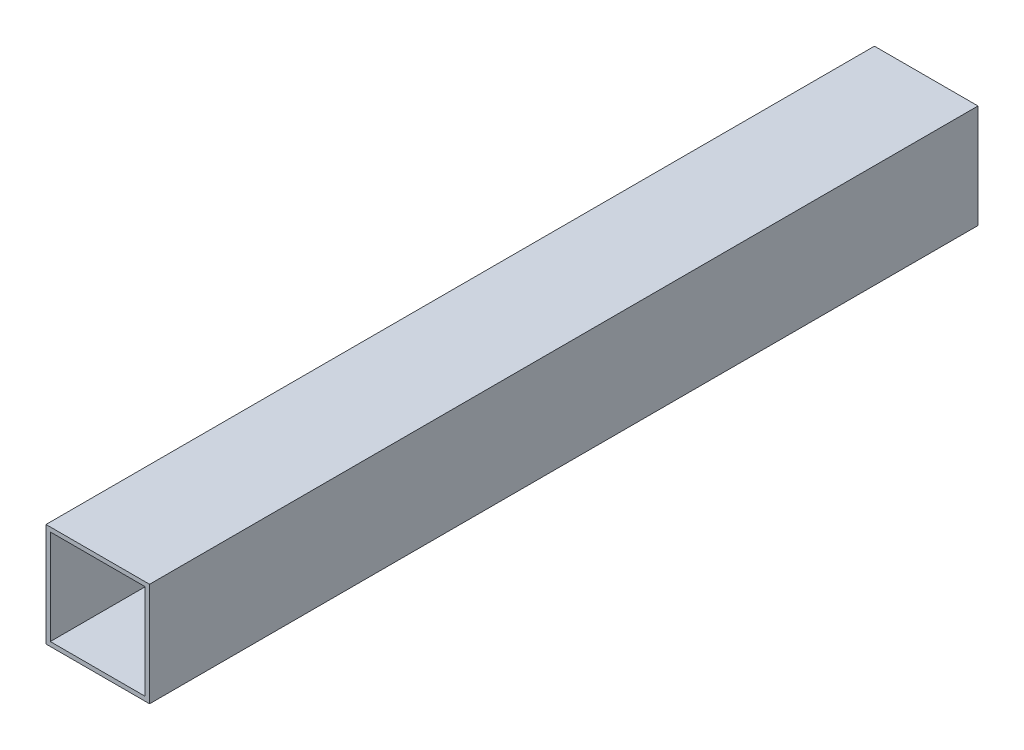
ISO-10303-21;
HEADER;
FILE_DESCRIPTION(('STEP AP214'),'2;1');
FILE_NAME('part.step','',(''),(''),'','','');
FILE_SCHEMA(('AUTOMOTIVE_DESIGN { 1 0 10303 214 1 1 1 1 }'));
ENDSEC;
DATA;
#1=APPLICATION_CONTEXT('core data for automotive mechanical design processes');
#2=APPLICATION_PROTOCOL_DEFINITION('international standard','automotive_design',2000,#1);
#3=PRODUCT_CONTEXT('',#1,'mechanical');
#4=PRODUCT('Part','Part','',(#3));
#5=PRODUCT_RELATED_PRODUCT_CATEGORY('part','',(#4));
#6=PRODUCT_DEFINITION_FORMATION('','',#4);
#7=PRODUCT_DEFINITION_CONTEXT('part definition',#1,'design');
#8=PRODUCT_DEFINITION('design','',#6,#7);
#9=PRODUCT_DEFINITION_SHAPE('','',#8);
#10=(LENGTH_UNIT() NAMED_UNIT(*) SI_UNIT(.MILLI.,.METRE.));
#11=(NAMED_UNIT(*) PLANE_ANGLE_UNIT() SI_UNIT($,.RADIAN.));
#12=(NAMED_UNIT(*) SI_UNIT($,.STERADIAN.) SOLID_ANGLE_UNIT());
#13=UNCERTAINTY_MEASURE_WITH_UNIT(LENGTH_MEASURE(1.E-05),#10,'distance_accuracy_value','');
#14=(GEOMETRIC_REPRESENTATION_CONTEXT(3) GLOBAL_UNCERTAINTY_ASSIGNED_CONTEXT((#13)) GLOBAL_UNIT_ASSIGNED_CONTEXT((#10,
#11,#12)) REPRESENTATION_CONTEXT('',''));
#15=CARTESIAN_POINT('',(0.,0.,0.));
#16=DIRECTION('',(0.,0.,1.));
#17=DIRECTION('',(1.,0.,0.));
#18=AXIS2_PLACEMENT_3D('',#15,#16,#17);
#19=CARTESIAN_POINT('',(0.,0.,304.8));
#20=DIRECTION('',(0.,0.,-1.));
#21=DIRECTION('',(-1.,0.,0.));
#22=AXIS2_PLACEMENT_3D('',#19,#20,#21);
#23=PLANE('',#22);
#24=DIRECTION('',(0.,-1.,0.));
#25=VECTOR('',#24,1.);
#26=CARTESIAN_POINT('',(0.,0.,304.8));
#27=LINE('',#26,#25);
#28=CARTESIAN_POINT('',(0.,38.1,304.8));
#29=VERTEX_POINT('',#28);
#30=CARTESIAN_POINT('',(0.,0.,304.8));
#31=VERTEX_POINT('',#30);
#32=EDGE_CURVE('E134',#29,#31,#27,.T.);
#33=ORIENTED_EDGE('',*,*,#32,.T.);
#34=DIRECTION('',(1.,0.,0.));
#35=VECTOR('',#34,1.);
#36=CARTESIAN_POINT('',(0.,0.,304.8));
#37=LINE('',#36,#35);
#38=CARTESIAN_POINT('',(38.1,0.,304.8));
#39=VERTEX_POINT('',#38);
#40=EDGE_CURVE('E137',#31,#39,#37,.T.);
#41=ORIENTED_EDGE('',*,*,#40,.T.);
#42=DIRECTION('',(0.,1.,0.));
#43=VECTOR('',#42,1.);
#44=CARTESIAN_POINT('',(38.1,0.,304.8));
#45=LINE('',#44,#43);
#46=CARTESIAN_POINT('',(38.1,38.1,304.8));
#47=VERTEX_POINT('',#46);
#48=EDGE_CURVE('E140',#39,#47,#45,.T.);
#49=ORIENTED_EDGE('',*,*,#48,.T.);
#50=DIRECTION('',(-1.,0.,0.));
#51=VECTOR('',#50,1.);
#52=CARTESIAN_POINT('',(0.,38.1,304.8));
#53=LINE('',#52,#51);
#54=EDGE_CURVE('E142',#47,#29,#53,.T.);
#55=ORIENTED_EDGE('',*,*,#54,.T.);
#56=EDGE_LOOP('',(#33,#41,#49,#55));
#57=FACE_BOUND('',#56,.T.);
#58=DIRECTION('',(0.,-1.,0.));
#59=VECTOR('',#58,1.);
#60=CARTESIAN_POINT('',(1.5875,1.5875,304.8));
#61=LINE('',#60,#59);
#62=CARTESIAN_POINT('',(1.5875,36.5125,304.8));
#63=VERTEX_POINT('',#62);
#64=CARTESIAN_POINT('',(1.5875,1.5875,304.8));
#65=VERTEX_POINT('',#64);
#66=EDGE_CURVE('E98',#63,#65,#61,.T.);
#67=ORIENTED_EDGE('',*,*,#66,.F.);
#68=DIRECTION('',(-1.,0.,0.));
#69=VECTOR('',#68,1.);
#70=CARTESIAN_POINT('',(1.5875,36.5125,304.8));
#71=LINE('',#70,#69);
#72=CARTESIAN_POINT('',(36.5125,36.5125,304.8));
#73=VERTEX_POINT('',#72);
#74=EDGE_CURVE('E120',#73,#63,#71,.T.);
#75=ORIENTED_EDGE('',*,*,#74,.F.);
#76=DIRECTION('',(0.,1.,0.));
#77=VECTOR('',#76,1.);
#78=CARTESIAN_POINT('',(36.5125,1.5875,304.8));
#79=LINE('',#78,#77);
#80=CARTESIAN_POINT('',(36.5125,1.5875,304.8));
#81=VERTEX_POINT('',#80);
#82=EDGE_CURVE('E118',#81,#73,#79,.T.);
#83=ORIENTED_EDGE('',*,*,#82,.F.);
#84=DIRECTION('',(1.,0.,0.));
#85=VECTOR('',#84,1.);
#86=CARTESIAN_POINT('',(1.5875,1.5875,304.8));
#87=LINE('',#86,#85);
#88=EDGE_CURVE('E106',#65,#81,#87,.T.);
#89=ORIENTED_EDGE('',*,*,#88,.F.);
#90=EDGE_LOOP('',(#67,#75,#83,#89));
#91=FACE_BOUND('',#90,.T.);
#92=ADVANCED_FACE('F33',(#57,#91),#23,.F.);
#93=CARTESIAN_POINT('',(0.,0.,0.));
#94=DIRECTION('',(0.,0.,-1.));
#95=DIRECTION('',(-1.,0.,0.));
#96=AXIS2_PLACEMENT_3D('',#93,#94,#95);
#97=PLANE('',#96);
#98=DIRECTION('',(0.,-1.,0.));
#99=VECTOR('',#98,1.);
#100=CARTESIAN_POINT('',(0.,0.,0.));
#101=LINE('',#100,#99);
#102=CARTESIAN_POINT('',(0.,38.1,0.));
#103=VERTEX_POINT('',#102);
#104=CARTESIAN_POINT('',(0.,0.,0.));
#105=VERTEX_POINT('',#104);
#106=EDGE_CURVE('E114',#103,#105,#101,.T.);
#107=ORIENTED_EDGE('',*,*,#106,.F.);
#108=DIRECTION('',(-1.,0.,0.));
#109=VECTOR('',#108,1.);
#110=CARTESIAN_POINT('',(0.,38.1,0.));
#111=LINE('',#110,#109);
#112=CARTESIAN_POINT('',(38.1,38.1,0.));
#113=VERTEX_POINT('',#112);
#114=EDGE_CURVE('E138',#113,#103,#111,.T.);
#115=ORIENTED_EDGE('',*,*,#114,.F.);
#116=DIRECTION('',(0.,1.,0.));
#117=VECTOR('',#116,1.);
#118=CARTESIAN_POINT('',(38.1,0.,0.));
#119=LINE('',#118,#117);
#120=CARTESIAN_POINT('',(38.1,0.,0.));
#121=VERTEX_POINT('',#120);
#122=EDGE_CURVE('E149',#121,#113,#119,.T.);
#123=ORIENTED_EDGE('',*,*,#122,.F.);
#124=DIRECTION('',(1.,0.,0.));
#125=VECTOR('',#124,1.);
#126=CARTESIAN_POINT('',(0.,0.,0.));
#127=LINE('',#126,#125);
#128=EDGE_CURVE('E147',#105,#121,#127,.T.);
#129=ORIENTED_EDGE('',*,*,#128,.F.);
#130=EDGE_LOOP('',(#107,#115,#123,#129));
#131=FACE_BOUND('',#130,.T.);
#132=DIRECTION('',(-1.,0.,0.));
#133=VECTOR('',#132,1.);
#134=CARTESIAN_POINT('',(1.5875,36.5125,0.));
#135=LINE('',#134,#133);
#136=CARTESIAN_POINT('',(36.5125,36.5125,0.));
#137=VERTEX_POINT('',#136);
#138=CARTESIAN_POINT('',(1.5875,36.5125,0.));
#139=VERTEX_POINT('',#138);
#140=EDGE_CURVE('E107',#137,#139,#135,.T.);
#141=ORIENTED_EDGE('',*,*,#140,.T.);
#142=DIRECTION('',(0.,-1.,0.));
#143=VECTOR('',#142,1.);
#144=CARTESIAN_POINT('',(1.5875,1.5875,0.));
#145=LINE('',#144,#143);
#146=CARTESIAN_POINT('',(1.5875,1.5875,0.));
#147=VERTEX_POINT('',#146);
#148=EDGE_CURVE('E56',#139,#147,#145,.T.);
#149=ORIENTED_EDGE('',*,*,#148,.T.);
#150=DIRECTION('',(1.,0.,0.));
#151=VECTOR('',#150,1.);
#152=CARTESIAN_POINT('',(1.5875,1.5875,0.));
#153=LINE('',#152,#151);
#154=CARTESIAN_POINT('',(36.5125,1.5875,0.));
#155=VERTEX_POINT('',#154);
#156=EDGE_CURVE('E113',#147,#155,#153,.T.);
#157=ORIENTED_EDGE('',*,*,#156,.T.);
#158=DIRECTION('',(0.,1.,0.));
#159=VECTOR('',#158,1.);
#160=CARTESIAN_POINT('',(36.5125,1.5875,0.));
#161=LINE('',#160,#159);
#162=EDGE_CURVE('E126',#155,#137,#161,.T.);
#163=ORIENTED_EDGE('',*,*,#162,.T.);
#164=EDGE_LOOP('',(#141,#149,#157,#163));
#165=FACE_BOUND('',#164,.T.);
#166=ADVANCED_FACE('F167',(#131,#165),#97,.T.);
#167=CARTESIAN_POINT('',(0.,0.,304.8));
#168=DIRECTION('',(1.,0.,0.));
#169=DIRECTION('',(0.,0.,-1.));
#170=AXIS2_PLACEMENT_3D('',#167,#168,#169);
#171=PLANE('',#170);
#172=ORIENTED_EDGE('',*,*,#106,.T.);
#173=DIRECTION('',(0.,0.,-1.));
#174=VECTOR('',#173,1.);
#175=CARTESIAN_POINT('',(0.,0.,304.8));
#176=LINE('',#175,#174);
#177=EDGE_CURVE('E11',#31,#105,#176,.T.);
#178=ORIENTED_EDGE('',*,*,#177,.F.);
#179=ORIENTED_EDGE('',*,*,#32,.F.);
#180=DIRECTION('',(0.,0.,-1.));
#181=VECTOR('',#180,1.);
#182=CARTESIAN_POINT('',(0.,38.1,304.8));
#183=LINE('',#182,#181);
#184=EDGE_CURVE('E144',#29,#103,#183,.T.);
#185=ORIENTED_EDGE('',*,*,#184,.T.);
#186=EDGE_LOOP('',(#172,#178,#179,#185));
#187=FACE_BOUND('',#186,.T.);
#188=ADVANCED_FACE('F35',(#187),#171,.F.);
#189=CARTESIAN_POINT('',(0.,0.,304.8));
#190=DIRECTION('',(0.,1.,0.));
#191=DIRECTION('',(0.,0.,1.));
#192=AXIS2_PLACEMENT_3D('',#189,#190,#191);
#193=PLANE('',#192);
#194=ORIENTED_EDGE('',*,*,#128,.T.);
#195=DIRECTION('',(0.,0.,-1.));
#196=VECTOR('',#195,1.);
#197=CARTESIAN_POINT('',(38.1,0.,304.8));
#198=LINE('',#197,#196);
#199=EDGE_CURVE('E41',#39,#121,#198,.T.);
#200=ORIENTED_EDGE('',*,*,#199,.F.);
#201=ORIENTED_EDGE('',*,*,#40,.F.);
#202=ORIENTED_EDGE('',*,*,#177,.T.);
#203=EDGE_LOOP('',(#194,#200,#201,#202));
#204=FACE_BOUND('',#203,.T.);
#205=ADVANCED_FACE('F177',(#204),#193,.F.);
#206=CARTESIAN_POINT('',(38.1,0.,304.8));
#207=DIRECTION('',(-1.,0.,0.));
#208=DIRECTION('',(0.,0.,1.));
#209=AXIS2_PLACEMENT_3D('',#206,#207,#208);
#210=PLANE('',#209);
#211=ORIENTED_EDGE('',*,*,#122,.T.);
#212=DIRECTION('',(0.,0.,-1.));
#213=VECTOR('',#212,1.);
#214=CARTESIAN_POINT('',(38.1,38.1,304.8));
#215=LINE('',#214,#213);
#216=EDGE_CURVE('E154',#47,#113,#215,.T.);
#217=ORIENTED_EDGE('',*,*,#216,.F.);
#218=ORIENTED_EDGE('',*,*,#48,.F.);
#219=ORIENTED_EDGE('',*,*,#199,.T.);
#220=EDGE_LOOP('',(#211,#217,#218,#219));
#221=FACE_BOUND('',#220,.T.);
#222=ADVANCED_FACE('F161',(#221),#210,.F.);
#223=CARTESIAN_POINT('',(0.,38.1,304.8));
#224=DIRECTION('',(0.,-1.,0.));
#225=DIRECTION('',(0.,0.,-1.));
#226=AXIS2_PLACEMENT_3D('',#223,#224,#225);
#227=PLANE('',#226);
#228=ORIENTED_EDGE('',*,*,#114,.T.);
#229=ORIENTED_EDGE('',*,*,#184,.F.);
#230=ORIENTED_EDGE('',*,*,#54,.F.);
#231=ORIENTED_EDGE('',*,*,#216,.T.);
#232=EDGE_LOOP('',(#228,#229,#230,#231));
#233=FACE_BOUND('',#232,.T.);
#234=ADVANCED_FACE('F171',(#233),#227,.F.);
#235=CARTESIAN_POINT('',(1.5875,1.5875,304.8));
#236=DIRECTION('',(1.,0.,0.));
#237=DIRECTION('',(0.,1.,0.));
#238=AXIS2_PLACEMENT_3D('',#235,#236,#237);
#239=PLANE('',#238);
#240=ORIENTED_EDGE('',*,*,#148,.F.);
#241=DIRECTION('',(0.,0.,-1.));
#242=VECTOR('',#241,1.);
#243=CARTESIAN_POINT('',(1.5875,36.5125,304.8));
#244=LINE('',#243,#242);
#245=EDGE_CURVE('E102',#63,#139,#244,.T.);
#246=ORIENTED_EDGE('',*,*,#245,.F.);
#247=ORIENTED_EDGE('',*,*,#66,.T.);
#248=DIRECTION('',(0.,0.,-1.));
#249=VECTOR('',#248,1.);
#250=CARTESIAN_POINT('',(1.5875,1.5875,304.8));
#251=LINE('',#250,#249);
#252=EDGE_CURVE('E101',#65,#147,#251,.T.);
#253=ORIENTED_EDGE('',*,*,#252,.T.);
#254=EDGE_LOOP('',(#240,#246,#247,#253));
#255=FACE_BOUND('',#254,.T.);
#256=ADVANCED_FACE('F100',(#255),#239,.T.);
#257=CARTESIAN_POINT('',(1.5875,1.5875,304.8));
#258=DIRECTION('',(0.,1.,0.));
#259=DIRECTION('',(0.,0.,1.));
#260=AXIS2_PLACEMENT_3D('',#257,#258,#259);
#261=PLANE('',#260);
#262=ORIENTED_EDGE('',*,*,#156,.F.);
#263=ORIENTED_EDGE('',*,*,#252,.F.);
#264=ORIENTED_EDGE('',*,*,#88,.T.);
#265=DIRECTION('',(0.,0.,-1.));
#266=VECTOR('',#265,1.);
#267=CARTESIAN_POINT('',(36.5125,1.5875,304.8));
#268=LINE('',#267,#266);
#269=EDGE_CURVE('E115',#81,#155,#268,.T.);
#270=ORIENTED_EDGE('',*,*,#269,.T.);
#271=EDGE_LOOP('',(#262,#263,#264,#270));
#272=FACE_BOUND('',#271,.T.);
#273=ADVANCED_FACE('F110',(#272),#261,.T.);
#274=CARTESIAN_POINT('',(36.5125,1.5875,304.8));
#275=DIRECTION('',(-1.,0.,0.));
#276=DIRECTION('',(0.,0.,1.));
#277=AXIS2_PLACEMENT_3D('',#274,#275,#276);
#278=PLANE('',#277);
#279=ORIENTED_EDGE('',*,*,#162,.F.);
#280=ORIENTED_EDGE('',*,*,#269,.F.);
#281=ORIENTED_EDGE('',*,*,#82,.T.);
#282=DIRECTION('',(0.,0.,-1.));
#283=VECTOR('',#282,1.);
#284=CARTESIAN_POINT('',(36.5125,36.5125,304.8));
#285=LINE('',#284,#283);
#286=EDGE_CURVE('E48',#73,#137,#285,.T.);
#287=ORIENTED_EDGE('',*,*,#286,.T.);
#288=EDGE_LOOP('',(#279,#280,#281,#287));
#289=FACE_BOUND('',#288,.T.);
#290=ADVANCED_FACE('F200',(#289),#278,.T.);
#291=CARTESIAN_POINT('',(1.5875,36.5125,304.8));
#292=DIRECTION('',(0.,-1.,0.));
#293=DIRECTION('',(0.,0.,-1.));
#294=AXIS2_PLACEMENT_3D('',#291,#292,#293);
#295=PLANE('',#294);
#296=ORIENTED_EDGE('',*,*,#140,.F.);
#297=ORIENTED_EDGE('',*,*,#286,.F.);
#298=ORIENTED_EDGE('',*,*,#74,.T.);
#299=ORIENTED_EDGE('',*,*,#245,.T.);
#300=EDGE_LOOP('',(#296,#297,#298,#299));
#301=FACE_BOUND('',#300,.T.);
#302=ADVANCED_FACE('F204',(#301),#295,.T.);
#303=CLOSED_SHELL('',(#92,#166,#188,#205,#222,#234,#256,#273,#290,#302));
#304=MANIFOLD_SOLID_BREP('B2',#303);
#305=ADVANCED_BREP_SHAPE_REPRESENTATION('',(#18,#304),#14);
#306=SHAPE_DEFINITION_REPRESENTATION(#9,#305);
ENDSEC;
END-ISO-10303-21;
